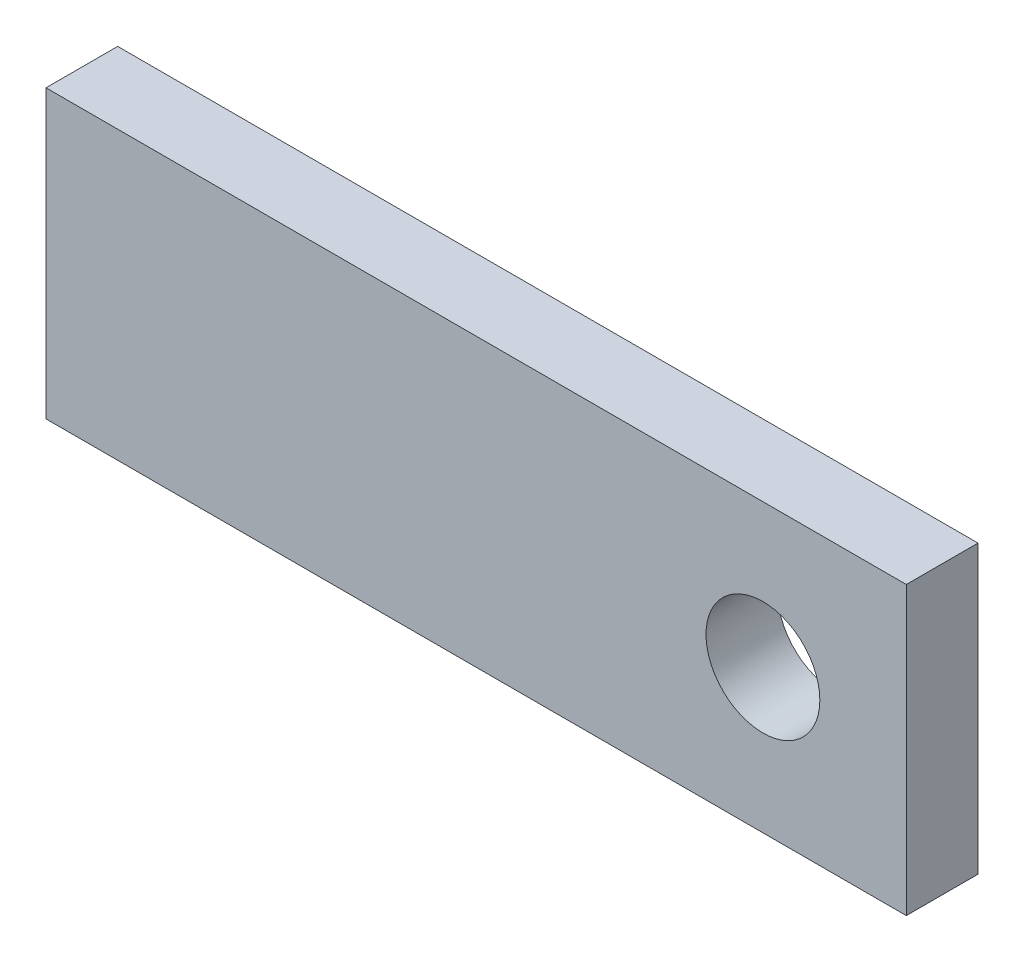
ISO-10303-21;
HEADER;
FILE_DESCRIPTION(('STEP AP214'),'2;1');
FILE_NAME('part.step','',(''),(''),'','','');
FILE_SCHEMA(('AUTOMOTIVE_DESIGN { 1 0 10303 214 1 1 1 1 }'));
ENDSEC;
DATA;
#1=APPLICATION_CONTEXT('core data for automotive mechanical design processes');
#2=APPLICATION_PROTOCOL_DEFINITION('international standard','automotive_design',2000,#1);
#3=PRODUCT_CONTEXT('',#1,'mechanical');
#4=PRODUCT('Part','Part','',(#3));
#5=PRODUCT_RELATED_PRODUCT_CATEGORY('part','',(#4));
#6=PRODUCT_DEFINITION_FORMATION('','',#4);
#7=PRODUCT_DEFINITION_CONTEXT('part definition',#1,'design');
#8=PRODUCT_DEFINITION('design','',#6,#7);
#9=PRODUCT_DEFINITION_SHAPE('','',#8);
#10=(LENGTH_UNIT() NAMED_UNIT(*) SI_UNIT(.MILLI.,.METRE.));
#11=(NAMED_UNIT(*) PLANE_ANGLE_UNIT() SI_UNIT($,.RADIAN.));
#12=(NAMED_UNIT(*) SI_UNIT($,.STERADIAN.) SOLID_ANGLE_UNIT());
#13=UNCERTAINTY_MEASURE_WITH_UNIT(LENGTH_MEASURE(1.E-05),#10,'distance_accuracy_value','');
#14=(GEOMETRIC_REPRESENTATION_CONTEXT(3) GLOBAL_UNCERTAINTY_ASSIGNED_CONTEXT((#13)) GLOBAL_UNIT_ASSIGNED_CONTEXT((#10,
#11,#12)) REPRESENTATION_CONTEXT('',''));
#15=CARTESIAN_POINT('',(0.,0.,0.));
#16=DIRECTION('',(0.,0.,1.));
#17=DIRECTION('',(1.,0.,0.));
#18=AXIS2_PLACEMENT_3D('',#15,#16,#17);
#19=CARTESIAN_POINT('',(38.1,-12.7,6.35));
#20=DIRECTION('',(-1.,0.,0.));
#21=DIRECTION('',(0.,0.,1.));
#22=AXIS2_PLACEMENT_3D('',#19,#20,#21);
#23=PLANE('',#22);
#24=DIRECTION('',(0.,1.,0.));
#25=VECTOR('',#24,1.);
#26=CARTESIAN_POINT('',(38.1,-12.7,0.));
#27=LINE('',#26,#25);
#28=CARTESIAN_POINT('',(38.1,-12.7,0.));
#29=VERTEX_POINT('',#28);
#30=CARTESIAN_POINT('',(38.1,12.7,0.));
#31=VERTEX_POINT('',#30);
#32=EDGE_CURVE('E102',#29,#31,#27,.T.);
#33=ORIENTED_EDGE('',*,*,#32,.T.);
#34=DIRECTION('',(0.,0.,-1.));
#35=VECTOR('',#34,1.);
#36=CARTESIAN_POINT('',(38.1,12.7,6.35));
#37=LINE('',#36,#35);
#38=CARTESIAN_POINT('',(38.1,12.7,6.35));
#39=VERTEX_POINT('',#38);
#40=EDGE_CURVE('E11',#39,#31,#37,.T.);
#41=ORIENTED_EDGE('',*,*,#40,.F.);
#42=DIRECTION('',(0.,1.,0.));
#43=VECTOR('',#42,1.);
#44=CARTESIAN_POINT('',(38.1,-12.7,6.35));
#45=LINE('',#44,#43);
#46=CARTESIAN_POINT('',(38.1,-12.7,6.35));
#47=VERTEX_POINT('',#46);
#48=EDGE_CURVE('E90',#47,#39,#45,.T.);
#49=ORIENTED_EDGE('',*,*,#48,.F.);
#50=DIRECTION('',(0.,0.,-1.));
#51=VECTOR('',#50,1.);
#52=CARTESIAN_POINT('',(38.1,-12.7,6.35));
#53=LINE('',#52,#51);
#54=EDGE_CURVE('E98',#47,#29,#53,.T.);
#55=ORIENTED_EDGE('',*,*,#54,.T.);
#56=EDGE_LOOP('',(#33,#41,#49,#55));
#57=FACE_BOUND('',#56,.T.);
#58=ADVANCED_FACE('F39',(#57),#23,.F.);
#59=CARTESIAN_POINT('',(-38.1,12.7,6.35));
#60=DIRECTION('',(0.,-1.,0.));
#61=DIRECTION('',(0.,0.,-1.));
#62=AXIS2_PLACEMENT_3D('',#59,#60,#61);
#63=PLANE('',#62);
#64=DIRECTION('',(-1.,0.,0.));
#65=VECTOR('',#64,1.);
#66=CARTESIAN_POINT('',(-38.1,12.7,0.));
#67=LINE('',#66,#65);
#68=CARTESIAN_POINT('',(-38.1,12.7,0.));
#69=VERTEX_POINT('',#68);
#70=EDGE_CURVE('E94',#31,#69,#67,.T.);
#71=ORIENTED_EDGE('',*,*,#70,.T.);
#72=DIRECTION('',(0.,0.,-1.));
#73=VECTOR('',#72,1.);
#74=CARTESIAN_POINT('',(-38.1,12.7,6.35));
#75=LINE('',#74,#73);
#76=CARTESIAN_POINT('',(-38.1,12.7,6.35));
#77=VERTEX_POINT('',#76);
#78=EDGE_CURVE('E47',#77,#69,#75,.T.);
#79=ORIENTED_EDGE('',*,*,#78,.F.);
#80=DIRECTION('',(-1.,0.,0.));
#81=VECTOR('',#80,1.);
#82=CARTESIAN_POINT('',(-38.1,12.7,6.35));
#83=LINE('',#82,#81);
#84=EDGE_CURVE('E85',#39,#77,#83,.T.);
#85=ORIENTED_EDGE('',*,*,#84,.F.);
#86=ORIENTED_EDGE('',*,*,#40,.T.);
#87=EDGE_LOOP('',(#71,#79,#85,#86));
#88=FACE_BOUND('',#87,.T.);
#89=ADVANCED_FACE('F93',(#88),#63,.F.);
#90=CARTESIAN_POINT('',(-38.1,-12.7,6.35));
#91=DIRECTION('',(1.,0.,0.));
#92=DIRECTION('',(0.,0.,-1.));
#93=AXIS2_PLACEMENT_3D('',#90,#91,#92);
#94=PLANE('',#93);
#95=DIRECTION('',(0.,-1.,0.));
#96=VECTOR('',#95,1.);
#97=CARTESIAN_POINT('',(-38.1,-12.7,0.));
#98=LINE('',#97,#96);
#99=CARTESIAN_POINT('',(-38.1,-12.7,0.));
#100=VERTEX_POINT('',#99);
#101=EDGE_CURVE('E72',#69,#100,#98,.T.);
#102=ORIENTED_EDGE('',*,*,#101,.T.);
#103=DIRECTION('',(0.,0.,-1.));
#104=VECTOR('',#103,1.);
#105=CARTESIAN_POINT('',(-38.1,-12.7,6.35));
#106=LINE('',#105,#104);
#107=CARTESIAN_POINT('',(-38.1,-12.7,6.35));
#108=VERTEX_POINT('',#107);
#109=EDGE_CURVE('E95',#108,#100,#106,.T.);
#110=ORIENTED_EDGE('',*,*,#109,.F.);
#111=DIRECTION('',(0.,-1.,0.));
#112=VECTOR('',#111,1.);
#113=CARTESIAN_POINT('',(-38.1,-12.7,6.35));
#114=LINE('',#113,#112);
#115=EDGE_CURVE('E88',#77,#108,#114,.T.);
#116=ORIENTED_EDGE('',*,*,#115,.F.);
#117=ORIENTED_EDGE('',*,*,#78,.T.);
#118=EDGE_LOOP('',(#102,#110,#116,#117));
#119=FACE_BOUND('',#118,.T.);
#120=ADVANCED_FACE('F96',(#119),#94,.F.);
#121=CARTESIAN_POINT('',(-38.1,-12.7,6.35));
#122=DIRECTION('',(0.,1.,0.));
#123=DIRECTION('',(0.,0.,1.));
#124=AXIS2_PLACEMENT_3D('',#121,#122,#123);
#125=PLANE('',#124);
#126=DIRECTION('',(1.,0.,0.));
#127=VECTOR('',#126,1.);
#128=CARTESIAN_POINT('',(-38.1,-12.7,0.));
#129=LINE('',#128,#127);
#130=EDGE_CURVE('E78',#100,#29,#129,.T.);
#131=ORIENTED_EDGE('',*,*,#130,.T.);
#132=ORIENTED_EDGE('',*,*,#54,.F.);
#133=DIRECTION('',(1.,0.,0.));
#134=VECTOR('',#133,1.);
#135=CARTESIAN_POINT('',(-38.1,-12.7,6.35));
#136=LINE('',#135,#134);
#137=EDGE_CURVE('E55',#108,#47,#136,.T.);
#138=ORIENTED_EDGE('',*,*,#137,.F.);
#139=ORIENTED_EDGE('',*,*,#109,.T.);
#140=EDGE_LOOP('',(#131,#132,#138,#139));
#141=FACE_BOUND('',#140,.T.);
#142=ADVANCED_FACE('F110',(#141),#125,.F.);
#143=CARTESIAN_POINT('',(38.1,12.7,6.35));
#144=DIRECTION('',(0.,0.,-1.));
#145=DIRECTION('',(-1.,0.,0.));
#146=AXIS2_PLACEMENT_3D('',#143,#144,#145);
#147=PLANE('',#146);
#148=CARTESIAN_POINT('',(25.4,0.,6.35));
#149=DIRECTION('',(0.,0.,1.));
#150=DIRECTION('',(1.,0.,0.));
#151=AXIS2_PLACEMENT_3D('',#148,#149,#150);
#152=CIRCLE('',#151,5.04189999999999);
#153=CARTESIAN_POINT('',(30.4419,0.,6.35));
#154=VERTEX_POINT('',#153);
#155=EDGE_CURVE('E118',#154,#154,#152,.T.);
#156=ORIENTED_EDGE('',*,*,#155,.F.);
#157=EDGE_LOOP('',(#156));
#158=FACE_BOUND('',#157,.T.);
#159=ORIENTED_EDGE('',*,*,#48,.T.);
#160=ORIENTED_EDGE('',*,*,#84,.T.);
#161=ORIENTED_EDGE('',*,*,#115,.T.);
#162=ORIENTED_EDGE('',*,*,#137,.T.);
#163=EDGE_LOOP('',(#159,#160,#161,#162));
#164=FACE_BOUND('',#163,.T.);
#165=ADVANCED_FACE('F86',(#158,#164),#147,.F.);
#166=CARTESIAN_POINT('',(38.1,12.7,0.));
#167=DIRECTION('',(0.,0.,-1.));
#168=DIRECTION('',(-1.,0.,0.));
#169=AXIS2_PLACEMENT_3D('',#166,#167,#168);
#170=PLANE('',#169);
#171=CARTESIAN_POINT('',(25.4,0.,0.));
#172=DIRECTION('',(0.,0.,-1.));
#173=DIRECTION('',(-1.,0.,0.));
#174=AXIS2_PLACEMENT_3D('',#171,#172,#173);
#175=CIRCLE('',#174,5.04189999999999);
#176=CARTESIAN_POINT('',(20.3581,0.,0.));
#177=VERTEX_POINT('',#176);
#178=EDGE_CURVE('E105',#177,#177,#175,.T.);
#179=ORIENTED_EDGE('',*,*,#178,.F.);
#180=EDGE_LOOP('',(#179));
#181=FACE_BOUND('',#180,.T.);
#182=ORIENTED_EDGE('',*,*,#32,.F.);
#183=ORIENTED_EDGE('',*,*,#130,.F.);
#184=ORIENTED_EDGE('',*,*,#101,.F.);
#185=ORIENTED_EDGE('',*,*,#70,.F.);
#186=EDGE_LOOP('',(#182,#183,#184,#185));
#187=FACE_BOUND('',#186,.T.);
#188=ADVANCED_FACE('F113',(#181,#187),#170,.T.);
#189=CARTESIAN_POINT('',(25.4,0.,6.35));
#190=DIRECTION('',(0.,0.,1.));
#191=DIRECTION('',(1.,0.,0.));
#192=AXIS2_PLACEMENT_3D('',#189,#190,#191);
#193=CYLINDRICAL_SURFACE('',#192,5.04189999999999);
#194=ORIENTED_EDGE('',*,*,#178,.T.);
#195=EDGE_LOOP('',(#194));
#196=FACE_BOUND('',#195,.T.);
#197=ORIENTED_EDGE('',*,*,#155,.T.);
#198=EDGE_LOOP('',(#197));
#199=FACE_BOUND('',#198,.T.);
#200=ADVANCED_FACE('F122',(#196,#199),#193,.F.);
#201=CLOSED_SHELL('',(#58,#89,#120,#142,#165,#188,#200));
#202=MANIFOLD_SOLID_BREP('B2',#201);
#203=ADVANCED_BREP_SHAPE_REPRESENTATION('',(#18,#202),#14);
#204=SHAPE_DEFINITION_REPRESENTATION(#9,#203);
ENDSEC;
END-ISO-10303-21;
